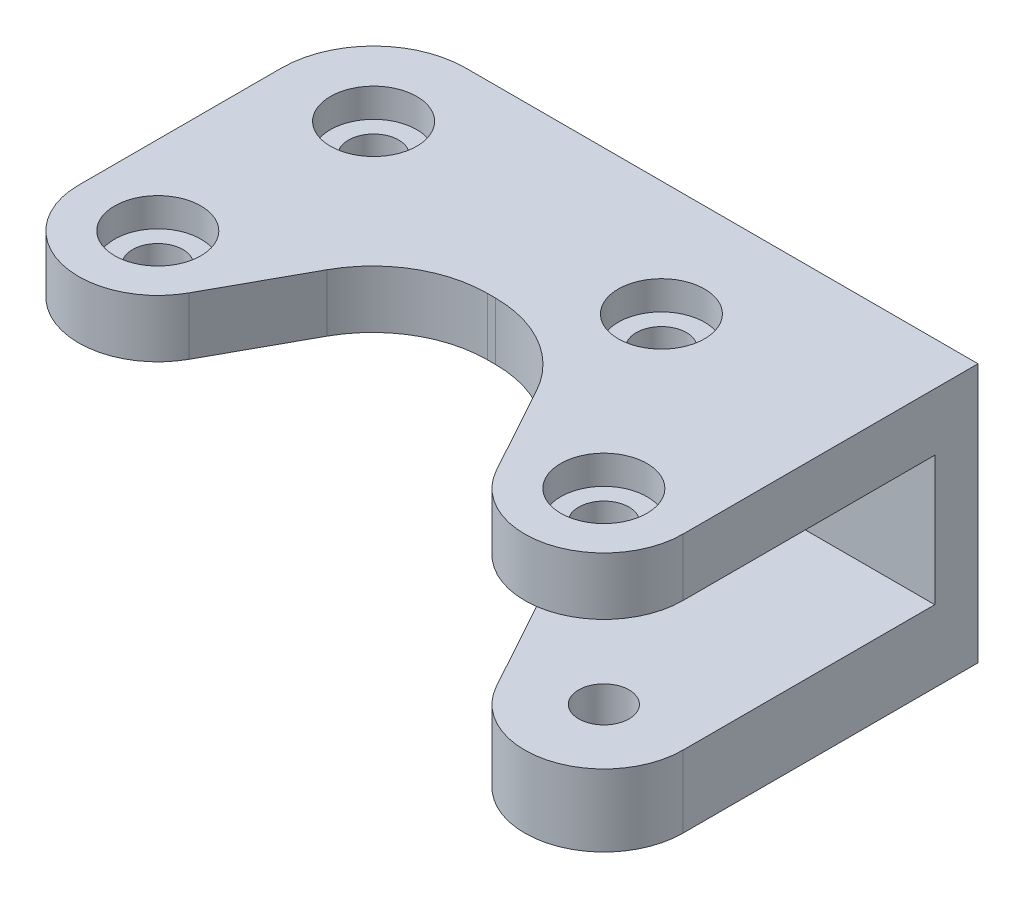
ISO-10303-21;
HEADER;
FILE_DESCRIPTION(('STEP AP214'),'2;1');
FILE_NAME('part.step','',(''),(''),'','','');
FILE_SCHEMA(('AUTOMOTIVE_DESIGN { 1 0 10303 214 1 1 1 1 }'));
ENDSEC;
DATA;
#1=APPLICATION_CONTEXT('core data for automotive mechanical design processes');
#2=APPLICATION_PROTOCOL_DEFINITION('international standard','automotive_design',2000,#1);
#3=PRODUCT_CONTEXT('',#1,'mechanical');
#4=PRODUCT('Part','Part','',(#3));
#5=PRODUCT_RELATED_PRODUCT_CATEGORY('part','',(#4));
#6=PRODUCT_DEFINITION_FORMATION('','',#4);
#7=PRODUCT_DEFINITION_CONTEXT('part definition',#1,'design');
#8=PRODUCT_DEFINITION('design','',#6,#7);
#9=PRODUCT_DEFINITION_SHAPE('','',#8);
#10=(LENGTH_UNIT() NAMED_UNIT(*) SI_UNIT(.MILLI.,.METRE.));
#11=(NAMED_UNIT(*) PLANE_ANGLE_UNIT() SI_UNIT($,.RADIAN.));
#12=(NAMED_UNIT(*) SI_UNIT($,.STERADIAN.) SOLID_ANGLE_UNIT());
#13=UNCERTAINTY_MEASURE_WITH_UNIT(LENGTH_MEASURE(1.E-05),#10,'distance_accuracy_value','');
#14=(GEOMETRIC_REPRESENTATION_CONTEXT(3) GLOBAL_UNCERTAINTY_ASSIGNED_CONTEXT((#13)) GLOBAL_UNIT_ASSIGNED_CONTEXT((#10,
#11,#12)) REPRESENTATION_CONTEXT('',''));
#15=CARTESIAN_POINT('',(0.,0.,0.));
#16=DIRECTION('',(0.,0.,1.));
#17=DIRECTION('',(1.,0.,0.));
#18=AXIS2_PLACEMENT_3D('',#15,#16,#17);
#19=CARTESIAN_POINT('',(14.,9.5,7.));
#20=DIRECTION('',(0.,0.,-1.));
#21=DIRECTION('',(-1.,0.,0.));
#22=AXIS2_PLACEMENT_3D('',#19,#20,#21);
#23=CYLINDRICAL_SURFACE('',#22,1.75);
#24=CARTESIAN_POINT('',(14.,9.5,3.));
#25=DIRECTION('',(0.,0.,-1.));
#26=DIRECTION('',(-1.,0.,0.));
#27=AXIS2_PLACEMENT_3D('',#24,#25,#26);
#28=CIRCLE('',#27,1.75);
#29=CARTESIAN_POINT('',(12.25,9.5,3.));
#30=VERTEX_POINT('',#29);
#31=EDGE_CURVE('E234',#30,#30,#28,.T.);
#32=ORIENTED_EDGE('',*,*,#31,.F.);
#33=EDGE_LOOP('',(#32));
#34=FACE_BOUND('',#33,.T.);
#35=CARTESIAN_POINT('',(14.,9.5,1.));
#36=DIRECTION('',(0.,0.,-1.));
#37=DIRECTION('',(-1.,0.,0.));
#38=AXIS2_PLACEMENT_3D('',#35,#36,#37);
#39=CIRCLE('',#38,1.75);
#40=CARTESIAN_POINT('',(12.25,9.5,1.));
#41=VERTEX_POINT('',#40);
#42=EDGE_CURVE('E250',#41,#41,#39,.F.);
#43=ORIENTED_EDGE('',*,*,#42,.F.);
#44=EDGE_LOOP('',(#43));
#45=FACE_BOUND('',#44,.T.);
#46=ADVANCED_FACE('F33',(#34,#45),#23,.F.);
#47=CARTESIAN_POINT('',(-14.59,8.,6.41));
#48=DIRECTION('',(0.,1.,0.));
#49=DIRECTION('',(0.,0.,1.));
#50=AXIS2_PLACEMENT_3D('',#47,#48,#49);
#51=CYLINDRICAL_SURFACE('',#50,1.75);
#52=CARTESIAN_POINT('',(-14.59,14.,6.41));
#53=DIRECTION('',(0.,1.,0.));
#54=DIRECTION('',(0.,0.,1.));
#55=AXIS2_PLACEMENT_3D('',#52,#53,#54);
#56=CIRCLE('',#55,1.75);
#57=CARTESIAN_POINT('',(-14.59,14.,8.16));
#58=VERTEX_POINT('',#57);
#59=EDGE_CURVE('E238',#58,#58,#56,.T.);
#60=ORIENTED_EDGE('',*,*,#59,.F.);
#61=EDGE_LOOP('',(#60));
#62=FACE_BOUND('',#61,.T.);
#63=CARTESIAN_POINT('',(-14.59,16.,6.41));
#64=DIRECTION('',(0.,1.,0.));
#65=DIRECTION('',(0.,0.,1.));
#66=AXIS2_PLACEMENT_3D('',#63,#64,#65);
#67=CIRCLE('',#66,1.75);
#68=CARTESIAN_POINT('',(-14.59,16.,8.16));
#69=VERTEX_POINT('',#68);
#70=EDGE_CURVE('E241',#69,#69,#67,.F.);
#71=ORIENTED_EDGE('',*,*,#70,.F.);
#72=EDGE_LOOP('',(#71));
#73=FACE_BOUND('',#72,.T.);
#74=ADVANCED_FACE('F397',(#62,#73),#51,.F.);
#75=CARTESIAN_POINT('',(7.,8.,8.));
#76=DIRECTION('',(0.,1.,0.));
#77=DIRECTION('',(0.,0.,1.));
#78=AXIS2_PLACEMENT_3D('',#75,#76,#77);
#79=CYLINDRICAL_SURFACE('',#78,1.75);
#80=CARTESIAN_POINT('',(7.,14.,8.));
#81=DIRECTION('',(0.,1.,0.));
#82=DIRECTION('',(0.,0.,1.));
#83=AXIS2_PLACEMENT_3D('',#80,#81,#82);
#84=CIRCLE('',#83,1.75);
#85=CARTESIAN_POINT('',(7.,14.,9.75));
#86=VERTEX_POINT('',#85);
#87=EDGE_CURVE('E237',#86,#86,#84,.T.);
#88=ORIENTED_EDGE('',*,*,#87,.F.);
#89=EDGE_LOOP('',(#88));
#90=FACE_BOUND('',#89,.T.);
#91=CARTESIAN_POINT('',(7.,16.,8.));
#92=DIRECTION('',(0.,1.,0.));
#93=DIRECTION('',(0.,0.,1.));
#94=AXIS2_PLACEMENT_3D('',#91,#92,#93);
#95=CIRCLE('',#94,1.75);
#96=CARTESIAN_POINT('',(7.,16.,9.75));
#97=VERTEX_POINT('',#96);
#98=EDGE_CURVE('E244',#97,#97,#95,.F.);
#99=ORIENTED_EDGE('',*,*,#98,.F.);
#100=EDGE_LOOP('',(#99));
#101=FACE_BOUND('',#100,.T.);
#102=ADVANCED_FACE('F404',(#90,#101),#79,.F.);
#103=CARTESIAN_POINT('',(-15.5,0.,20.5));
#104=DIRECTION('',(0.,1.,0.));
#105=DIRECTION('',(0.,0.,1.));
#106=AXIS2_PLACEMENT_3D('',#103,#104,#105);
#107=PLANE('',#106);
#108=CARTESIAN_POINT('',(15.5,0.,20.5));
#109=DIRECTION('',(0.,1.,0.));
#110=DIRECTION('',(0.,0.,1.));
#111=AXIS2_PLACEMENT_3D('',#108,#109,#110);
#112=CIRCLE('',#111,1.74999999999999);
#113=CARTESIAN_POINT('',(15.5,0.,22.25));
#114=VERTEX_POINT('',#113);
#115=EDGE_CURVE('E207',#114,#114,#112,.T.);
#116=ORIENTED_EDGE('',*,*,#115,.T.);
#117=EDGE_LOOP('',(#116));
#118=FACE_BOUND('',#117,.T.);
#119=DIRECTION('',(0.,0.,1.));
#120=VECTOR('',#119,1.);
#121=CARTESIAN_POINT('',(0.,0.,0.));
#122=LINE('',#121,#120);
#123=CARTESIAN_POINT('',(0.,0.,0.));
#124=VERTEX_POINT('',#123);
#125=CARTESIAN_POINT('',(0.,0.,3.70870115636353));
#126=VERTEX_POINT('',#125);
#127=EDGE_CURVE('E154',#124,#126,#122,.T.);
#128=ORIENTED_EDGE('',*,*,#127,.F.);
#129=DIRECTION('',(-1.,0.,0.));
#130=VECTOR('',#129,1.);
#131=CARTESIAN_POINT('',(-21.,0.,0.));
#132=LINE('',#131,#130);
#133=CARTESIAN_POINT('',(21.,0.,0.));
#134=VERTEX_POINT('',#133);
#135=EDGE_CURVE('E166',#134,#124,#132,.T.);
#136=ORIENTED_EDGE('',*,*,#135,.F.);
#137=DIRECTION('',(0.,0.,-1.));
#138=VECTOR('',#137,1.);
#139=CARTESIAN_POINT('',(21.,0.,20.5));
#140=LINE('',#139,#138);
#141=CARTESIAN_POINT('',(21.,0.,20.5));
#142=VERTEX_POINT('',#141);
#143=EDGE_CURVE('E175',#142,#134,#140,.T.);
#144=ORIENTED_EDGE('',*,*,#143,.F.);
#145=CARTESIAN_POINT('',(15.5,0.,20.5));
#146=DIRECTION('',(0.,1.,0.));
#147=DIRECTION('',(0.,0.,1.));
#148=AXIS2_PLACEMENT_3D('',#145,#146,#147);
#149=CIRCLE('',#148,5.5);
#150=CARTESIAN_POINT('',(10.6795350402363,0.,23.1482291388191));
#151=VERTEX_POINT('',#150);
#152=EDGE_CURVE('E179',#151,#142,#149,.T.);
#153=ORIENTED_EDGE('',*,*,#152,.F.);
#154=DIRECTION('',(0.481496207058014,0.,0.876448174502489));
#155=VECTOR('',#154,1.);
#156=CARTESIAN_POINT('',(10.6795350402363,0.,23.1482291388191));
#157=LINE('',#156,#155);
#158=EDGE_CURVE('E168',#126,#151,#157,.T.);
#159=ORIENTED_EDGE('',*,*,#158,.F.);
#160=EDGE_LOOP('',(#128,#136,#144,#153,#159));
#161=FACE_BOUND('',#160,.T.);
#162=ADVANCED_FACE('F164',(#118,#161),#107,.F.);
#163=CARTESIAN_POINT('',(10.6795350402363,18.,23.1482291388191));
#164=DIRECTION('',(0.876448174502489,0.,-0.481496207058014));
#165=DIRECTION('',(-0.481496207058014,0.,-0.876448174502489));
#166=AXIS2_PLACEMENT_3D('',#163,#164,#165);
#167=PLANE('',#166);
#168=DIRECTION('',(0.,1.,0.));
#169=VECTOR('',#168,1.);
#170=CARTESIAN_POINT('',(0.,18.,3.70870115636353));
#171=LINE('',#170,#169);
#172=CARTESIAN_POINT('',(0.,5.,3.70870115636353));
#173=VERTEX_POINT('',#172);
#174=EDGE_CURVE('E348',#126,#173,#171,.T.);
#175=ORIENTED_EDGE('',*,*,#174,.F.);
#176=ORIENTED_EDGE('',*,*,#158,.T.);
#177=DIRECTION('',(0.,-1.,0.));
#178=VECTOR('',#177,1.);
#179=CARTESIAN_POINT('',(10.6795350402363,18.,23.1482291388191));
#180=LINE('',#179,#178);
#181=CARTESIAN_POINT('',(10.6795350402363,5.,23.1482291388191));
#182=VERTEX_POINT('',#181);
#183=EDGE_CURVE('E189',#182,#151,#180,.T.);
#184=ORIENTED_EDGE('',*,*,#183,.F.);
#185=DIRECTION('',(-0.481496207058014,0.,-0.876448174502489));
#186=VECTOR('',#185,1.);
#187=CARTESIAN_POINT('',(10.6795350402363,5.,23.1482291388191));
#188=LINE('',#187,#186);
#189=EDGE_CURVE('E273',#182,#173,#188,.T.);
#190=ORIENTED_EDGE('',*,*,#189,.T.);
#191=EDGE_LOOP('',(#175,#176,#184,#190));
#192=FACE_BOUND('',#191,.T.);
#193=ADVANCED_FACE('F347',(#192),#167,.F.);
#194=CARTESIAN_POINT('',(-21.,18.,0.));
#195=DIRECTION('',(0.,0.,1.));
#196=DIRECTION('',(1.,0.,0.));
#197=AXIS2_PLACEMENT_3D('',#194,#195,#196);
#198=PLANE('',#197);
#199=CARTESIAN_POINT('',(14.,9.5,0.));
#200=DIRECTION('',(0.,0.,-1.));
#201=DIRECTION('',(-1.,0.,0.));
#202=AXIS2_PLACEMENT_3D('',#199,#200,#201);
#203=CIRCLE('',#202,3.);
#204=CARTESIAN_POINT('',(11.,9.5,0.));
#205=VERTEX_POINT('',#204);
#206=EDGE_CURVE('E366',#205,#205,#203,.T.);
#207=ORIENTED_EDGE('',*,*,#206,.F.);
#208=EDGE_LOOP('',(#207));
#209=FACE_BOUND('',#208,.T.);
#210=DIRECTION('',(1.,0.,0.));
#211=VECTOR('',#210,1.);
#212=CARTESIAN_POINT('',(-21.,14.,0.));
#213=LINE('',#212,#211);
#214=CARTESIAN_POINT('',(-14.59,14.,0.));
#215=VERTEX_POINT('',#214);
#216=CARTESIAN_POINT('',(0.,14.,0.));
#217=VERTEX_POINT('',#216);
#218=EDGE_CURVE('E349',#215,#217,#213,.T.);
#219=ORIENTED_EDGE('',*,*,#218,.F.);
#220=DIRECTION('',(0.,-1.,0.));
#221=VECTOR('',#220,1.);
#222=CARTESIAN_POINT('',(-14.59,18.,0.));
#223=LINE('',#222,#221);
#224=CARTESIAN_POINT('',(-14.59,18.,0.));
#225=VERTEX_POINT('',#224);
#226=EDGE_CURVE('E41',#215,#225,#223,.F.);
#227=ORIENTED_EDGE('',*,*,#226,.T.);
#228=DIRECTION('',(-1.,0.,0.));
#229=VECTOR('',#228,1.);
#230=CARTESIAN_POINT('',(-21.,18.,0.));
#231=LINE('',#230,#229);
#232=CARTESIAN_POINT('',(21.,18.,0.));
#233=VERTEX_POINT('',#232);
#234=EDGE_CURVE('E185',#233,#225,#231,.T.);
#235=ORIENTED_EDGE('',*,*,#234,.F.);
#236=DIRECTION('',(0.,-1.,0.));
#237=VECTOR('',#236,1.);
#238=CARTESIAN_POINT('',(21.,18.,0.));
#239=LINE('',#238,#237);
#240=EDGE_CURVE('E173',#233,#134,#239,.T.);
#241=ORIENTED_EDGE('',*,*,#240,.T.);
#242=ORIENTED_EDGE('',*,*,#135,.T.);
#243=DIRECTION('',(0.,1.,0.));
#244=VECTOR('',#243,1.);
#245=CARTESIAN_POINT('',(0.,0.,0.));
#246=LINE('',#245,#244);
#247=EDGE_CURVE('E151',#124,#217,#246,.T.);
#248=ORIENTED_EDGE('',*,*,#247,.T.);
#249=EDGE_LOOP('',(#219,#227,#235,#241,#242,#248));
#250=FACE_BOUND('',#249,.T.);
#251=ADVANCED_FACE('F171',(#209,#250),#198,.F.);
#252=CARTESIAN_POINT('',(21.,5.,26.));
#253=DIRECTION('',(0.,-1.,0.));
#254=DIRECTION('',(1.,0.,0.));
#255=AXIS2_PLACEMENT_3D('',#252,#253,#254);
#256=PLANE('',#255);
#257=CARTESIAN_POINT('',(15.5,5.,20.5));
#258=DIRECTION('',(0.,-1.,0.));
#259=DIRECTION('',(1.,0.,0.));
#260=AXIS2_PLACEMENT_3D('',#257,#258,#259);
#261=CIRCLE('',#260,1.74999999999999);
#262=CARTESIAN_POINT('',(17.25,5.,20.5));
#263=VERTEX_POINT('',#262);
#264=EDGE_CURVE('E281',#263,#263,#261,.T.);
#265=ORIENTED_EDGE('',*,*,#264,.T.);
#266=EDGE_LOOP('',(#265));
#267=FACE_BOUND('',#266,.T.);
#268=DIRECTION('',(0.,0.,-1.));
#269=VECTOR('',#268,1.);
#270=CARTESIAN_POINT('',(0.,5.,26.));
#271=LINE('',#270,#269);
#272=CARTESIAN_POINT('',(0.,5.,3.));
#273=VERTEX_POINT('',#272);
#274=EDGE_CURVE('E159',#173,#273,#271,.T.);
#275=ORIENTED_EDGE('',*,*,#274,.F.);
#276=ORIENTED_EDGE('',*,*,#189,.F.);
#277=CARTESIAN_POINT('',(15.5,5.,20.5));
#278=DIRECTION('',(0.,-1.,0.));
#279=DIRECTION('',(1.,0.,0.));
#280=AXIS2_PLACEMENT_3D('',#277,#278,#279);
#281=CIRCLE('',#280,5.5);
#282=CARTESIAN_POINT('',(21.,5.,20.5));
#283=VERTEX_POINT('',#282);
#284=EDGE_CURVE('E270',#283,#182,#281,.T.);
#285=ORIENTED_EDGE('',*,*,#284,.F.);
#286=DIRECTION('',(0.,0.,1.));
#287=VECTOR('',#286,1.);
#288=CARTESIAN_POINT('',(21.,5.,20.5));
#289=LINE('',#288,#287);
#290=CARTESIAN_POINT('',(21.,5.,3.));
#291=VERTEX_POINT('',#290);
#292=EDGE_CURVE('E199',#291,#283,#289,.T.);
#293=ORIENTED_EDGE('',*,*,#292,.F.);
#294=DIRECTION('',(-1.,0.,0.));
#295=VECTOR('',#294,1.);
#296=CARTESIAN_POINT('',(21.,5.,3.));
#297=LINE('',#296,#295);
#298=EDGE_CURVE('E275',#291,#273,#297,.T.);
#299=ORIENTED_EDGE('',*,*,#298,.T.);
#300=EDGE_LOOP('',(#275,#276,#285,#293,#299));
#301=FACE_BOUND('',#300,.T.);
#302=ADVANCED_FACE('F344',(#267,#301),#256,.F.);
#303=CARTESIAN_POINT('',(0.,0.,3.));
#304=DIRECTION('',(0.,0.,-1.));
#305=DIRECTION('',(-1.,0.,0.));
#306=AXIS2_PLACEMENT_3D('',#303,#304,#305);
#307=PLANE('',#306);
#308=ORIENTED_EDGE('',*,*,#31,.T.);
#309=EDGE_LOOP('',(#308));
#310=FACE_BOUND('',#309,.T.);
#311=DIRECTION('',(0.,1.,0.));
#312=VECTOR('',#311,1.);
#313=CARTESIAN_POINT('',(0.,0.,3.));
#314=LINE('',#313,#312);
#315=CARTESIAN_POINT('',(0.,14.,3.));
#316=VERTEX_POINT('',#315);
#317=EDGE_CURVE('E231',#273,#316,#314,.T.);
#318=ORIENTED_EDGE('',*,*,#317,.F.);
#319=ORIENTED_EDGE('',*,*,#298,.F.);
#320=DIRECTION('',(0.,-1.,0.));
#321=VECTOR('',#320,1.);
#322=CARTESIAN_POINT('',(21.,14.,3.));
#323=LINE('',#322,#321);
#324=CARTESIAN_POINT('',(21.,14.,3.));
#325=VERTEX_POINT('',#324);
#326=EDGE_CURVE('E340',#325,#291,#323,.T.);
#327=ORIENTED_EDGE('',*,*,#326,.F.);
#328=DIRECTION('',(1.,0.,0.));
#329=VECTOR('',#328,1.);
#330=CARTESIAN_POINT('',(21.,14.,3.));
#331=LINE('',#330,#329);
#332=EDGE_CURVE('E271',#316,#325,#331,.T.);
#333=ORIENTED_EDGE('',*,*,#332,.F.);
#334=EDGE_LOOP('',(#318,#319,#327,#333));
#335=FACE_BOUND('',#334,.T.);
#336=ADVANCED_FACE('F388',(#310,#335),#307,.F.);
#337=CARTESIAN_POINT('',(15.5,18.,20.5));
#338=DIRECTION('',(0.,-1.,0.));
#339=DIRECTION('',(0.,0.,-1.));
#340=AXIS2_PLACEMENT_3D('',#337,#338,#339);
#341=CYLINDRICAL_SURFACE('',#340,1.74999999999999);
#342=CARTESIAN_POINT('',(15.5,14.,20.5));
#343=DIRECTION('',(0.,1.,0.));
#344=DIRECTION('',(0.,0.,1.));
#345=AXIS2_PLACEMENT_3D('',#342,#343,#344);
#346=CIRCLE('',#345,1.74999999999999);
#347=CARTESIAN_POINT('',(15.5,14.,22.25));
#348=VERTEX_POINT('',#347);
#349=EDGE_CURVE('E298',#348,#348,#346,.T.);
#350=ORIENTED_EDGE('',*,*,#349,.F.);
#351=EDGE_LOOP('',(#350));
#352=FACE_BOUND('',#351,.T.);
#353=CARTESIAN_POINT('',(15.5,16.,20.5));
#354=DIRECTION('',(0.,1.,0.));
#355=DIRECTION('',(0.,0.,1.));
#356=AXIS2_PLACEMENT_3D('',#353,#354,#355);
#357=CIRCLE('',#356,1.74999999999999);
#358=CARTESIAN_POINT('',(15.5,16.,22.25));
#359=VERTEX_POINT('',#358);
#360=EDGE_CURVE('E203',#359,#359,#357,.T.);
#361=ORIENTED_EDGE('',*,*,#360,.T.);
#362=EDGE_LOOP('',(#361));
#363=FACE_BOUND('',#362,.T.);
#364=ADVANCED_FACE('F416',(#352,#363),#341,.F.);
#365=CARTESIAN_POINT('',(-15.5,18.,20.5));
#366=DIRECTION('',(0.,-1.,0.));
#367=DIRECTION('',(0.,0.,-1.));
#368=AXIS2_PLACEMENT_3D('',#365,#366,#367);
#369=CYLINDRICAL_SURFACE('',#368,1.75);
#370=CARTESIAN_POINT('',(-15.5,14.,20.5));
#371=DIRECTION('',(0.,1.,0.));
#372=DIRECTION('',(0.,0.,1.));
#373=AXIS2_PLACEMENT_3D('',#370,#371,#372);
#374=CIRCLE('',#373,1.75);
#375=CARTESIAN_POINT('',(-15.5,14.,22.25));
#376=VERTEX_POINT('',#375);
#377=EDGE_CURVE('E295',#376,#376,#374,.T.);
#378=ORIENTED_EDGE('',*,*,#377,.F.);
#379=EDGE_LOOP('',(#378));
#380=FACE_BOUND('',#379,.T.);
#381=CARTESIAN_POINT('',(-15.5,16.,20.5));
#382=DIRECTION('',(0.,1.,0.));
#383=DIRECTION('',(0.,0.,1.));
#384=AXIS2_PLACEMENT_3D('',#381,#382,#383);
#385=CIRCLE('',#384,1.75);
#386=CARTESIAN_POINT('',(-15.5,16.,22.25));
#387=VERTEX_POINT('',#386);
#388=EDGE_CURVE('E200',#387,#387,#385,.T.);
#389=ORIENTED_EDGE('',*,*,#388,.T.);
#390=EDGE_LOOP('',(#389));
#391=FACE_BOUND('',#390,.T.);
#392=ADVANCED_FACE('F438',(#380,#391),#369,.F.);
#393=CARTESIAN_POINT('',(-5.,18.,12.81));
#394=DIRECTION('',(-0.876448174502489,0.,-0.481496207058014));
#395=DIRECTION('',(-0.481496207058015,0.,0.876448174502489));
#396=AXIS2_PLACEMENT_3D('',#393,#394,#395);
#397=PLANE('',#396);
#398=DIRECTION('',(0.481496207058015,0.,-0.876448174502489));
#399=VECTOR('',#398,1.);
#400=CARTESIAN_POINT('',(-5.,14.,12.81));
#401=LINE('',#400,#399);
#402=CARTESIAN_POINT('',(-10.6795350402363,14.,23.1482291388191));
#403=VERTEX_POINT('',#402);
#404=CARTESIAN_POINT('',(-7.27881229635491,14.,16.9580303435359));
#405=VERTEX_POINT('',#404);
#406=EDGE_CURVE('E291',#403,#405,#401,.T.);
#407=ORIENTED_EDGE('',*,*,#406,.T.);
#408=DIRECTION('',(0.,-1.,0.));
#409=VECTOR('',#408,1.);
#410=CARTESIAN_POINT('',(-7.2788122963549,18.,16.9580303435359));
#411=LINE('',#410,#409);
#412=CARTESIAN_POINT('',(-7.2788122963549,18.,16.9580303435359));
#413=VERTEX_POINT('',#412);
#414=EDGE_CURVE('E218',#405,#413,#411,.F.);
#415=ORIENTED_EDGE('',*,*,#414,.T.);
#416=DIRECTION('',(0.481496207058014,0.,-0.876448174502489));
#417=VECTOR('',#416,1.);
#418=CARTESIAN_POINT('',(-5.,18.,12.81));
#419=LINE('',#418,#417);
#420=CARTESIAN_POINT('',(-10.6795350402363,18.,23.1482291388191));
#421=VERTEX_POINT('',#420);
#422=EDGE_CURVE('E315',#421,#413,#419,.T.);
#423=ORIENTED_EDGE('',*,*,#422,.F.);
#424=DIRECTION('',(0.,-1.,0.));
#425=VECTOR('',#424,1.);
#426=CARTESIAN_POINT('',(-10.6795350402363,18.,23.1482291388191));
#427=LINE('',#426,#425);
#428=EDGE_CURVE('E193',#421,#403,#427,.T.);
#429=ORIENTED_EDGE('',*,*,#428,.T.);
#430=EDGE_LOOP('',(#407,#415,#423,#429));
#431=FACE_BOUND('',#430,.T.);
#432=ADVANCED_FACE('F441',(#431),#397,.F.);
#433=CARTESIAN_POINT('',(-5.,18.,12.81));
#434=DIRECTION('',(0.,0.,-1.));
#435=DIRECTION('',(-1.,0.,0.));
#436=AXIS2_PLACEMENT_3D('',#433,#434,#435);
#437=PLANE('',#436);
#438=DIRECTION('',(1.,0.,0.));
#439=VECTOR('',#438,1.);
#440=CARTESIAN_POINT('',(-5.,18.,12.81));
#441=LINE('',#440,#439);
#442=CARTESIAN_POINT('',(-0.267226900334994,18.,12.81));
#443=VERTEX_POINT('',#442);
#444=CARTESIAN_POINT('',(0.267226900334988,18.,12.81));
#445=VERTEX_POINT('',#444);
#446=EDGE_CURVE('E318',#443,#445,#441,.T.);
#447=ORIENTED_EDGE('',*,*,#446,.F.);
#448=DIRECTION('',(0.,-1.,0.));
#449=VECTOR('',#448,1.);
#450=CARTESIAN_POINT('',(-0.267226900334993,14.,12.81));
#451=LINE('',#450,#449);
#452=CARTESIAN_POINT('',(-0.267226900334994,14.,12.81));
#453=VERTEX_POINT('',#452);
#454=EDGE_CURVE('E215',#443,#453,#451,.T.);
#455=ORIENTED_EDGE('',*,*,#454,.T.);
#456=DIRECTION('',(1.,0.,0.));
#457=VECTOR('',#456,1.);
#458=CARTESIAN_POINT('',(-5.,14.,12.81));
#459=LINE('',#458,#457);
#460=CARTESIAN_POINT('',(0.267226900334988,14.,12.81));
#461=VERTEX_POINT('',#460);
#462=EDGE_CURVE('E288',#453,#461,#459,.T.);
#463=ORIENTED_EDGE('',*,*,#462,.T.);
#464=DIRECTION('',(0.,-1.,0.));
#465=VECTOR('',#464,1.);
#466=CARTESIAN_POINT('',(0.267226900334988,18.,12.81));
#467=LINE('',#466,#465);
#468=EDGE_CURVE('E213',#461,#445,#467,.F.);
#469=ORIENTED_EDGE('',*,*,#468,.T.);
#470=EDGE_LOOP('',(#447,#455,#463,#469));
#471=FACE_BOUND('',#470,.T.);
#472=ADVANCED_FACE('F532',(#471),#437,.F.);
#473=DIRECTION('',(0.481496207058014,0.,0.876448174502489));
#474=VECTOR('',#473,1.);
#475=CARTESIAN_POINT('',(10.6795350402363,18.,23.1482291388191));
#476=LINE('',#475,#474);
#477=CARTESIAN_POINT('',(7.27881229635491,18.,16.9580303435359));
#478=VERTEX_POINT('',#477);
#479=CARTESIAN_POINT('',(10.6795350402363,18.,23.1482291388191));
#480=VERTEX_POINT('',#479);
#481=EDGE_CURVE('E321',#478,#480,#476,.T.);
#482=ORIENTED_EDGE('',*,*,#481,.F.);
#483=DIRECTION('',(0.,-1.,0.));
#484=VECTOR('',#483,1.);
#485=CARTESIAN_POINT('',(7.27881229635491,14.,16.9580303435359));
#486=LINE('',#485,#484);
#487=CARTESIAN_POINT('',(7.27881229635491,14.,16.9580303435359));
#488=VERTEX_POINT('',#487);
#489=EDGE_CURVE('E220',#478,#488,#486,.T.);
#490=ORIENTED_EDGE('',*,*,#489,.T.);
#491=DIRECTION('',(0.481496207058014,0.,0.876448174502489));
#492=VECTOR('',#491,1.);
#493=CARTESIAN_POINT('',(10.6795350402363,14.,23.1482291388191));
#494=LINE('',#493,#492);
#495=CARTESIAN_POINT('',(10.6795350402363,14.,23.1482291388191));
#496=VERTEX_POINT('',#495);
#497=EDGE_CURVE('E286',#488,#496,#494,.T.);
#498=ORIENTED_EDGE('',*,*,#497,.T.);
#499=EDGE_CURVE('E190',#480,#496,#180,.T.);
#500=ORIENTED_EDGE('',*,*,#499,.F.);
#501=EDGE_LOOP('',(#482,#490,#498,#500));
#502=FACE_BOUND('',#501,.T.);
#503=ADVANCED_FACE('F393',(#502),#167,.F.);
#504=CARTESIAN_POINT('',(15.5,18.,20.5));
#505=DIRECTION('',(0.,-1.,0.));
#506=DIRECTION('',(0.,0.,-1.));
#507=AXIS2_PLACEMENT_3D('',#504,#505,#506);
#508=CYLINDRICAL_SURFACE('',#507,5.5);
#509=CARTESIAN_POINT('',(15.5,14.,20.5));
#510=DIRECTION('',(0.,1.,0.));
#511=DIRECTION('',(0.,0.,1.));
#512=AXIS2_PLACEMENT_3D('',#509,#510,#511);
#513=CIRCLE('',#512,5.5);
#514=CARTESIAN_POINT('',(21.,14.,20.5));
#515=VERTEX_POINT('',#514);
#516=EDGE_CURVE('E284',#496,#515,#513,.T.);
#517=ORIENTED_EDGE('',*,*,#516,.T.);
#518=DIRECTION('',(0.,-1.,0.));
#519=VECTOR('',#518,1.);
#520=CARTESIAN_POINT('',(21.,18.,20.5));
#521=LINE('',#520,#519);
#522=CARTESIAN_POINT('',(21.,18.,20.5));
#523=VERTEX_POINT('',#522);
#524=EDGE_CURVE('E186',#523,#515,#521,.T.);
#525=ORIENTED_EDGE('',*,*,#524,.F.);
#526=CARTESIAN_POINT('',(15.5,18.,20.5));
#527=DIRECTION('',(0.,1.,0.));
#528=DIRECTION('',(0.,0.,1.));
#529=AXIS2_PLACEMENT_3D('',#526,#527,#528);
#530=CIRCLE('',#529,5.5);
#531=EDGE_CURVE('E323',#480,#523,#530,.T.);
#532=ORIENTED_EDGE('',*,*,#531,.F.);
#533=ORIENTED_EDGE('',*,*,#499,.T.);
#534=EDGE_LOOP('',(#517,#525,#532,#533));
#535=FACE_BOUND('',#534,.T.);
#536=ADVANCED_FACE('F447',(#535),#508,.T.);
#537=ORIENTED_EDGE('',*,*,#264,.F.);
#538=EDGE_LOOP('',(#537));
#539=FACE_BOUND('',#538,.T.);
#540=ORIENTED_EDGE('',*,*,#115,.F.);
#541=EDGE_LOOP('',(#540));
#542=FACE_BOUND('',#541,.T.);
#543=ADVANCED_FACE('F443',(#539,#542),#341,.F.);
#544=CARTESIAN_POINT('',(-15.5,18.,20.5));
#545=DIRECTION('',(0.,1.,0.));
#546=DIRECTION('',(0.,0.,1.));
#547=AXIS2_PLACEMENT_3D('',#544,#545,#546);
#548=PLANE('',#547);
#549=CARTESIAN_POINT('',(7.,18.,8.));
#550=DIRECTION('',(0.,1.,0.));
#551=DIRECTION('',(0.,0.,1.));
#552=AXIS2_PLACEMENT_3D('',#549,#550,#551);
#553=CIRCLE('',#552,3.);
#554=CARTESIAN_POINT('',(7.,18.,11.));
#555=VERTEX_POINT('',#554);
#556=EDGE_CURVE('E361',#555,#555,#553,.T.);
#557=ORIENTED_EDGE('',*,*,#556,.F.);
#558=EDGE_LOOP('',(#557));
#559=FACE_BOUND('',#558,.T.);
#560=CARTESIAN_POINT('',(-14.59,18.,6.41));
#561=DIRECTION('',(0.,1.,0.));
#562=DIRECTION('',(0.,0.,1.));
#563=AXIS2_PLACEMENT_3D('',#560,#561,#562);
#564=CIRCLE('',#563,3.);
#565=CARTESIAN_POINT('',(-14.59,18.,9.41));
#566=VERTEX_POINT('',#565);
#567=EDGE_CURVE('E253',#566,#566,#564,.T.);
#568=ORIENTED_EDGE('',*,*,#567,.F.);
#569=EDGE_LOOP('',(#568));
#570=FACE_BOUND('',#569,.T.);
#571=CARTESIAN_POINT('',(-15.5,18.,20.5));
#572=DIRECTION('',(0.,1.,0.));
#573=DIRECTION('',(0.,0.,1.));
#574=AXIS2_PLACEMENT_3D('',#571,#572,#573);
#575=CIRCLE('',#574,3.);
#576=CARTESIAN_POINT('',(-15.5,18.,23.5));
#577=VERTEX_POINT('',#576);
#578=EDGE_CURVE('E304',#577,#577,#575,.T.);
#579=ORIENTED_EDGE('',*,*,#578,.F.);
#580=EDGE_LOOP('',(#579));
#581=FACE_BOUND('',#580,.T.);
#582=CARTESIAN_POINT('',(15.5,18.,20.5));
#583=DIRECTION('',(0.,1.,0.));
#584=DIRECTION('',(0.,0.,1.));
#585=AXIS2_PLACEMENT_3D('',#582,#583,#584);
#586=CIRCLE('',#585,3.);
#587=CARTESIAN_POINT('',(15.5,18.,23.5));
#588=VERTEX_POINT('',#587);
#589=EDGE_CURVE('E301',#588,#588,#586,.T.);
#590=ORIENTED_EDGE('',*,*,#589,.F.);
#591=EDGE_LOOP('',(#590));
#592=FACE_BOUND('',#591,.T.);
#593=ORIENTED_EDGE('',*,*,#234,.T.);
#594=CARTESIAN_POINT('',(-14.59,18.,6.41));
#595=DIRECTION('',(0.,1.,0.));
#596=DIRECTION('',(0.,0.,1.));
#597=AXIS2_PLACEMENT_3D('',#594,#595,#596);
#598=CIRCLE('',#597,6.41);
#599=CARTESIAN_POINT('',(-21.,18.,6.41));
#600=VERTEX_POINT('',#599);
#601=EDGE_CURVE('E11',#225,#600,#598,.T.);
#602=ORIENTED_EDGE('',*,*,#601,.T.);
#603=DIRECTION('',(0.,0.,1.));
#604=VECTOR('',#603,1.);
#605=CARTESIAN_POINT('',(-21.,18.,0.));
#606=LINE('',#605,#604);
#607=CARTESIAN_POINT('',(-21.,18.,20.5));
#608=VERTEX_POINT('',#607);
#609=EDGE_CURVE('E174',#600,#608,#606,.T.);
#610=ORIENTED_EDGE('',*,*,#609,.T.);
#611=CARTESIAN_POINT('',(-15.5,18.,20.5));
#612=DIRECTION('',(0.,1.,0.));
#613=DIRECTION('',(0.,0.,1.));
#614=AXIS2_PLACEMENT_3D('',#611,#612,#613);
#615=CIRCLE('',#614,5.5);
#616=EDGE_CURVE('E177',#608,#421,#615,.T.);
#617=ORIENTED_EDGE('',*,*,#616,.T.);
#618=ORIENTED_EDGE('',*,*,#422,.T.);
#619=CARTESIAN_POINT('',(-0.267226900334992,18.,20.81));
#620=DIRECTION('',(0.,1.,0.));
#621=DIRECTION('',(0.,0.,1.));
#622=AXIS2_PLACEMENT_3D('',#619,#620,#621);
#623=CIRCLE('',#622,8.);
#624=EDGE_CURVE('E225',#413,#443,#623,.F.);
#625=ORIENTED_EDGE('',*,*,#624,.T.);
#626=ORIENTED_EDGE('',*,*,#446,.T.);
#627=CARTESIAN_POINT('',(0.267226900334989,18.,20.81));
#628=DIRECTION('',(0.,1.,0.));
#629=DIRECTION('',(0.,0.,1.));
#630=AXIS2_PLACEMENT_3D('',#627,#628,#629);
#631=CIRCLE('',#630,8.);
#632=EDGE_CURVE('E229',#445,#478,#631,.F.);
#633=ORIENTED_EDGE('',*,*,#632,.T.);
#634=ORIENTED_EDGE('',*,*,#481,.T.);
#635=ORIENTED_EDGE('',*,*,#531,.T.);
#636=DIRECTION('',(0.,0.,-1.));
#637=VECTOR('',#636,1.);
#638=CARTESIAN_POINT('',(21.,18.,20.5));
#639=LINE('',#638,#637);
#640=EDGE_CURVE('E325',#523,#233,#639,.T.);
#641=ORIENTED_EDGE('',*,*,#640,.T.);
#642=EDGE_LOOP('',(#593,#602,#610,#617,#618,#625,#626,#633,#634,#635,#641));
#643=FACE_BOUND('',#642,.T.);
#644=ADVANCED_FACE('F446',(#559,#570,#581,#592,#643),#548,.T.);
#645=CARTESIAN_POINT('',(-21.,18.,0.));
#646=DIRECTION('',(1.,0.,0.));
#647=DIRECTION('',(0.,0.,-1.));
#648=AXIS2_PLACEMENT_3D('',#645,#646,#647);
#649=PLANE('',#648);
#650=ORIENTED_EDGE('',*,*,#609,.F.);
#651=DIRECTION('',(0.,-1.,0.));
#652=VECTOR('',#651,1.);
#653=CARTESIAN_POINT('',(-21.,18.,6.41));
#654=LINE('',#653,#652);
#655=CARTESIAN_POINT('',(-21.,14.,6.41));
#656=VERTEX_POINT('',#655);
#657=EDGE_CURVE('E233',#600,#656,#654,.T.);
#658=ORIENTED_EDGE('',*,*,#657,.T.);
#659=DIRECTION('',(0.,0.,-1.));
#660=VECTOR('',#659,1.);
#661=CARTESIAN_POINT('',(-21.,14.,26.));
#662=LINE('',#661,#660);
#663=CARTESIAN_POINT('',(-21.,14.,20.5));
#664=VERTEX_POINT('',#663);
#665=EDGE_CURVE('E263',#664,#656,#662,.T.);
#666=ORIENTED_EDGE('',*,*,#665,.F.);
#667=DIRECTION('',(0.,-1.,0.));
#668=VECTOR('',#667,1.);
#669=CARTESIAN_POINT('',(-21.,18.,20.5));
#670=LINE('',#669,#668);
#671=EDGE_CURVE('E196',#608,#664,#670,.T.);
#672=ORIENTED_EDGE('',*,*,#671,.F.);
#673=EDGE_LOOP('',(#650,#658,#666,#672));
#674=FACE_BOUND('',#673,.T.);
#675=ADVANCED_FACE('F261',(#674),#649,.F.);
#676=CARTESIAN_POINT('',(-15.5,18.,20.5));
#677=DIRECTION('',(0.,-1.,0.));
#678=DIRECTION('',(0.,0.,-1.));
#679=AXIS2_PLACEMENT_3D('',#676,#677,#678);
#680=CYLINDRICAL_SURFACE('',#679,5.5);
#681=CARTESIAN_POINT('',(-15.5,14.,20.5));
#682=DIRECTION('',(0.,1.,0.));
#683=DIRECTION('',(0.,0.,1.));
#684=AXIS2_PLACEMENT_3D('',#681,#682,#683);
#685=CIRCLE('',#684,5.5);
#686=EDGE_CURVE('E269',#664,#403,#685,.T.);
#687=ORIENTED_EDGE('',*,*,#686,.T.);
#688=ORIENTED_EDGE('',*,*,#428,.F.);
#689=ORIENTED_EDGE('',*,*,#616,.F.);
#690=ORIENTED_EDGE('',*,*,#671,.T.);
#691=EDGE_LOOP('',(#687,#688,#689,#690));
#692=FACE_BOUND('',#691,.T.);
#693=ADVANCED_FACE('F504',(#692),#680,.T.);
#694=EDGE_CURVE('E184',#283,#142,#521,.T.);
#695=ORIENTED_EDGE('',*,*,#694,.F.);
#696=ORIENTED_EDGE('',*,*,#284,.T.);
#697=ORIENTED_EDGE('',*,*,#183,.T.);
#698=ORIENTED_EDGE('',*,*,#152,.T.);
#699=EDGE_LOOP('',(#695,#696,#697,#698));
#700=FACE_BOUND('',#699,.T.);
#701=ADVANCED_FACE('F332',(#700),#508,.T.);
#702=CARTESIAN_POINT('',(21.,18.,20.5));
#703=DIRECTION('',(-1.,0.,0.));
#704=DIRECTION('',(0.,0.,1.));
#705=AXIS2_PLACEMENT_3D('',#702,#703,#704);
#706=PLANE('',#705);
#707=ORIENTED_EDGE('',*,*,#524,.T.);
#708=DIRECTION('',(0.,0.,-1.));
#709=VECTOR('',#708,1.);
#710=CARTESIAN_POINT('',(21.,14.,20.5));
#711=LINE('',#710,#709);
#712=EDGE_CURVE('E210',#515,#325,#711,.T.);
#713=ORIENTED_EDGE('',*,*,#712,.T.);
#714=ORIENTED_EDGE('',*,*,#326,.T.);
#715=ORIENTED_EDGE('',*,*,#292,.T.);
#716=ORIENTED_EDGE('',*,*,#694,.T.);
#717=ORIENTED_EDGE('',*,*,#143,.T.);
#718=ORIENTED_EDGE('',*,*,#240,.F.);
#719=ORIENTED_EDGE('',*,*,#640,.F.);
#720=EDGE_LOOP('',(#707,#713,#714,#715,#716,#717,#718,#719));
#721=FACE_BOUND('',#720,.T.);
#722=ADVANCED_FACE('F335',(#721),#706,.F.);
#723=CARTESIAN_POINT('',(-15.5,16.,20.5));
#724=DIRECTION('',(0.,1.,0.));
#725=DIRECTION('',(0.,0.,1.));
#726=AXIS2_PLACEMENT_3D('',#723,#724,#725);
#727=CYLINDRICAL_SURFACE('',#726,3.);
#728=CARTESIAN_POINT('',(-15.5,16.,20.5));
#729=DIRECTION('',(0.,1.,0.));
#730=DIRECTION('',(0.,0.,1.));
#731=AXIS2_PLACEMENT_3D('',#728,#729,#730);
#732=CIRCLE('',#731,3.);
#733=CARTESIAN_POINT('',(-15.5,16.,23.5));
#734=VERTEX_POINT('',#733);
#735=EDGE_CURVE('E204',#734,#734,#732,.T.);
#736=ORIENTED_EDGE('',*,*,#735,.F.);
#737=EDGE_LOOP('',(#736));
#738=FACE_BOUND('',#737,.T.);
#739=ORIENTED_EDGE('',*,*,#578,.T.);
#740=EDGE_LOOP('',(#739));
#741=FACE_BOUND('',#740,.T.);
#742=ADVANCED_FACE('F427',(#738,#741),#727,.F.);
#743=CARTESIAN_POINT('',(-15.5,16.,20.5));
#744=DIRECTION('',(0.,1.,0.));
#745=DIRECTION('',(0.,0.,1.));
#746=AXIS2_PLACEMENT_3D('',#743,#744,#745);
#747=PLANE('',#746);
#748=ORIENTED_EDGE('',*,*,#388,.F.);
#749=EDGE_LOOP('',(#748));
#750=FACE_BOUND('',#749,.T.);
#751=ORIENTED_EDGE('',*,*,#735,.T.);
#752=EDGE_LOOP('',(#751));
#753=FACE_BOUND('',#752,.T.);
#754=ADVANCED_FACE('F423',(#750,#753),#747,.T.);
#755=CARTESIAN_POINT('',(15.5,16.,20.5));
#756=DIRECTION('',(0.,1.,0.));
#757=DIRECTION('',(0.,0.,1.));
#758=AXIS2_PLACEMENT_3D('',#755,#756,#757);
#759=CYLINDRICAL_SURFACE('',#758,3.);
#760=CARTESIAN_POINT('',(15.5,16.,20.5));
#761=DIRECTION('',(0.,1.,0.));
#762=DIRECTION('',(0.,0.,1.));
#763=AXIS2_PLACEMENT_3D('',#760,#761,#762);
#764=CIRCLE('',#763,3.);
#765=CARTESIAN_POINT('',(15.5,16.,23.5));
#766=VERTEX_POINT('',#765);
#767=EDGE_CURVE('E307',#766,#766,#764,.T.);
#768=ORIENTED_EDGE('',*,*,#767,.F.);
#769=EDGE_LOOP('',(#768));
#770=FACE_BOUND('',#769,.T.);
#771=ORIENTED_EDGE('',*,*,#589,.T.);
#772=EDGE_LOOP('',(#771));
#773=FACE_BOUND('',#772,.T.);
#774=ADVANCED_FACE('F426',(#770,#773),#759,.F.);
#775=CARTESIAN_POINT('',(15.5,16.,20.5));
#776=DIRECTION('',(0.,1.,0.));
#777=DIRECTION('',(0.,0.,1.));
#778=AXIS2_PLACEMENT_3D('',#775,#776,#777);
#779=PLANE('',#778);
#780=ORIENTED_EDGE('',*,*,#360,.F.);
#781=EDGE_LOOP('',(#780));
#782=FACE_BOUND('',#781,.T.);
#783=ORIENTED_EDGE('',*,*,#767,.T.);
#784=EDGE_LOOP('',(#783));
#785=FACE_BOUND('',#784,.T.);
#786=ADVANCED_FACE('F420',(#782,#785),#779,.T.);
#787=CARTESIAN_POINT('',(21.,14.,26.));
#788=DIRECTION('',(0.,1.,0.));
#789=DIRECTION('',(0.,0.,1.));
#790=AXIS2_PLACEMENT_3D('',#787,#788,#789);
#791=PLANE('',#790);
#792=ORIENTED_EDGE('',*,*,#87,.T.);
#793=EDGE_LOOP('',(#792));
#794=FACE_BOUND('',#793,.T.);
#795=ORIENTED_EDGE('',*,*,#59,.T.);
#796=EDGE_LOOP('',(#795));
#797=FACE_BOUND('',#796,.T.);
#798=ORIENTED_EDGE('',*,*,#665,.T.);
#799=CARTESIAN_POINT('',(-14.59,14.,6.41));
#800=DIRECTION('',(0.,1.,0.));
#801=DIRECTION('',(0.,0.,1.));
#802=AXIS2_PLACEMENT_3D('',#799,#800,#801);
#803=CIRCLE('',#802,6.41);
#804=EDGE_CURVE('E55',#656,#215,#803,.F.);
#805=ORIENTED_EDGE('',*,*,#804,.T.);
#806=ORIENTED_EDGE('',*,*,#218,.T.);
#807=DIRECTION('',(0.,0.,1.));
#808=VECTOR('',#807,1.);
#809=CARTESIAN_POINT('',(0.,14.,0.));
#810=LINE('',#809,#808);
#811=EDGE_CURVE('E157',#217,#316,#810,.T.);
#812=ORIENTED_EDGE('',*,*,#811,.T.);
#813=ORIENTED_EDGE('',*,*,#332,.T.);
#814=ORIENTED_EDGE('',*,*,#712,.F.);
#815=ORIENTED_EDGE('',*,*,#516,.F.);
#816=ORIENTED_EDGE('',*,*,#497,.F.);
#817=CARTESIAN_POINT('',(0.267226900334989,14.,20.81));
#818=DIRECTION('',(0.,1.,0.));
#819=DIRECTION('',(0.,0.,1.));
#820=AXIS2_PLACEMENT_3D('',#817,#818,#819);
#821=CIRCLE('',#820,8.);
#822=EDGE_CURVE('E227',#488,#461,#821,.T.);
#823=ORIENTED_EDGE('',*,*,#822,.T.);
#824=ORIENTED_EDGE('',*,*,#462,.F.);
#825=CARTESIAN_POINT('',(-0.267226900334992,14.,20.81));
#826=DIRECTION('',(0.,1.,0.));
#827=DIRECTION('',(0.,0.,1.));
#828=AXIS2_PLACEMENT_3D('',#825,#826,#827);
#829=CIRCLE('',#828,8.);
#830=EDGE_CURVE('E223',#453,#405,#829,.T.);
#831=ORIENTED_EDGE('',*,*,#830,.T.);
#832=ORIENTED_EDGE('',*,*,#406,.F.);
#833=ORIENTED_EDGE('',*,*,#686,.F.);
#834=EDGE_LOOP('',(#798,#805,#806,#812,#813,#814,#815,#816,#823,#824,#831,#832,#833));
#835=FACE_BOUND('',#834,.T.);
#836=ORIENTED_EDGE('',*,*,#377,.T.);
#837=EDGE_LOOP('',(#836));
#838=FACE_BOUND('',#837,.T.);
#839=ORIENTED_EDGE('',*,*,#349,.T.);
#840=EDGE_LOOP('',(#839));
#841=FACE_BOUND('',#840,.T.);
#842=ADVANCED_FACE('F266',(#794,#797,#835,#838,#841),#791,.F.);
#843=CARTESIAN_POINT('',(-0.267226900334992,18.,20.81));
#844=DIRECTION('',(0.,1.,0.));
#845=DIRECTION('',(0.,0.,1.));
#846=AXIS2_PLACEMENT_3D('',#843,#844,#845);
#847=CYLINDRICAL_SURFACE('',#846,8.);
#848=ORIENTED_EDGE('',*,*,#624,.F.);
#849=ORIENTED_EDGE('',*,*,#414,.F.);
#850=ORIENTED_EDGE('',*,*,#830,.F.);
#851=ORIENTED_EDGE('',*,*,#454,.F.);
#852=EDGE_LOOP('',(#848,#849,#850,#851));
#853=FACE_BOUND('',#852,.T.);
#854=ADVANCED_FACE('F419',(#853),#847,.F.);
#855=CARTESIAN_POINT('',(0.267226900334989,18.,20.81));
#856=DIRECTION('',(0.,1.,0.));
#857=DIRECTION('',(0.,0.,1.));
#858=AXIS2_PLACEMENT_3D('',#855,#856,#857);
#859=CYLINDRICAL_SURFACE('',#858,8.);
#860=ORIENTED_EDGE('',*,*,#632,.F.);
#861=ORIENTED_EDGE('',*,*,#468,.F.);
#862=ORIENTED_EDGE('',*,*,#822,.F.);
#863=ORIENTED_EDGE('',*,*,#489,.F.);
#864=EDGE_LOOP('',(#860,#861,#862,#863));
#865=FACE_BOUND('',#864,.T.);
#866=ADVANCED_FACE('F413',(#865),#859,.F.);
#867=CARTESIAN_POINT('',(0.,0.,0.));
#868=DIRECTION('',(-1.,0.,0.));
#869=DIRECTION('',(0.,0.,1.));
#870=AXIS2_PLACEMENT_3D('',#867,#868,#869);
#871=PLANE('',#870);
#872=ORIENTED_EDGE('',*,*,#174,.T.);
#873=ORIENTED_EDGE('',*,*,#274,.T.);
#874=ORIENTED_EDGE('',*,*,#317,.T.);
#875=ORIENTED_EDGE('',*,*,#811,.F.);
#876=ORIENTED_EDGE('',*,*,#247,.F.);
#877=ORIENTED_EDGE('',*,*,#127,.T.);
#878=EDGE_LOOP('',(#872,#873,#874,#875,#876,#877));
#879=FACE_BOUND('',#878,.T.);
#880=ADVANCED_FACE('F153',(#879),#871,.T.);
#881=CARTESIAN_POINT('',(7.,16.,8.));
#882=DIRECTION('',(0.,1.,0.));
#883=DIRECTION('',(0.,0.,1.));
#884=AXIS2_PLACEMENT_3D('',#881,#882,#883);
#885=PLANE('',#884);
#886=CARTESIAN_POINT('',(7.,16.,8.));
#887=DIRECTION('',(0.,1.,0.));
#888=DIRECTION('',(0.,0.,1.));
#889=AXIS2_PLACEMENT_3D('',#886,#887,#888);
#890=CIRCLE('',#889,3.);
#891=CARTESIAN_POINT('',(7.,16.,11.));
#892=VERTEX_POINT('',#891);
#893=EDGE_CURVE('E247',#892,#892,#890,.T.);
#894=ORIENTED_EDGE('',*,*,#893,.T.);
#895=EDGE_LOOP('',(#894));
#896=FACE_BOUND('',#895,.T.);
#897=ORIENTED_EDGE('',*,*,#98,.T.);
#898=EDGE_LOOP('',(#897));
#899=FACE_BOUND('',#898,.T.);
#900=ADVANCED_FACE('F412',(#896,#899),#885,.T.);
#901=CARTESIAN_POINT('',(7.,16.,8.));
#902=DIRECTION('',(0.,1.,0.));
#903=DIRECTION('',(0.,0.,1.));
#904=AXIS2_PLACEMENT_3D('',#901,#902,#903);
#905=CYLINDRICAL_SURFACE('',#904,3.);
#906=ORIENTED_EDGE('',*,*,#893,.F.);
#907=EDGE_LOOP('',(#906));
#908=FACE_BOUND('',#907,.T.);
#909=ORIENTED_EDGE('',*,*,#556,.T.);
#910=EDGE_LOOP('',(#909));
#911=FACE_BOUND('',#910,.T.);
#912=ADVANCED_FACE('F472',(#908,#911),#905,.F.);
#913=CARTESIAN_POINT('',(-14.59,16.,6.41));
#914=DIRECTION('',(0.,1.,0.));
#915=DIRECTION('',(0.,0.,1.));
#916=AXIS2_PLACEMENT_3D('',#913,#914,#915);
#917=PLANE('',#916);
#918=CARTESIAN_POINT('',(-14.59,16.,6.41));
#919=DIRECTION('',(0.,1.,0.));
#920=DIRECTION('',(0.,0.,1.));
#921=AXIS2_PLACEMENT_3D('',#918,#919,#920);
#922=CIRCLE('',#921,3.);
#923=CARTESIAN_POINT('',(-14.59,16.,9.41));
#924=VERTEX_POINT('',#923);
#925=EDGE_CURVE('E358',#924,#924,#922,.T.);
#926=ORIENTED_EDGE('',*,*,#925,.T.);
#927=EDGE_LOOP('',(#926));
#928=FACE_BOUND('',#927,.T.);
#929=ORIENTED_EDGE('',*,*,#70,.T.);
#930=EDGE_LOOP('',(#929));
#931=FACE_BOUND('',#930,.T.);
#932=ADVANCED_FACE('F468',(#928,#931),#917,.T.);
#933=CARTESIAN_POINT('',(-14.59,16.,6.41));
#934=DIRECTION('',(0.,1.,0.));
#935=DIRECTION('',(0.,0.,1.));
#936=AXIS2_PLACEMENT_3D('',#933,#934,#935);
#937=CYLINDRICAL_SURFACE('',#936,3.);
#938=ORIENTED_EDGE('',*,*,#925,.F.);
#939=EDGE_LOOP('',(#938));
#940=FACE_BOUND('',#939,.T.);
#941=ORIENTED_EDGE('',*,*,#567,.T.);
#942=EDGE_LOOP('',(#941));
#943=FACE_BOUND('',#942,.T.);
#944=ADVANCED_FACE('F465',(#940,#943),#937,.F.);
#945=CARTESIAN_POINT('',(14.,9.5,1.));
#946=DIRECTION('',(0.,0.,-1.));
#947=DIRECTION('',(-1.,0.,0.));
#948=AXIS2_PLACEMENT_3D('',#945,#946,#947);
#949=PLANE('',#948);
#950=CARTESIAN_POINT('',(14.,9.5,1.));
#951=DIRECTION('',(0.,0.,-1.));
#952=DIRECTION('',(-1.,0.,0.));
#953=AXIS2_PLACEMENT_3D('',#950,#951,#952);
#954=CIRCLE('',#953,3.);
#955=CARTESIAN_POINT('',(11.,9.5,1.));
#956=VERTEX_POINT('',#955);
#957=EDGE_CURVE('E254',#956,#956,#954,.T.);
#958=ORIENTED_EDGE('',*,*,#957,.T.);
#959=EDGE_LOOP('',(#958));
#960=FACE_BOUND('',#959,.T.);
#961=ORIENTED_EDGE('',*,*,#42,.T.);
#962=EDGE_LOOP('',(#961));
#963=FACE_BOUND('',#962,.T.);
#964=ADVANCED_FACE('F372',(#960,#963),#949,.T.);
#965=CARTESIAN_POINT('',(14.,9.5,1.));
#966=DIRECTION('',(0.,0.,-1.));
#967=DIRECTION('',(-1.,0.,0.));
#968=AXIS2_PLACEMENT_3D('',#965,#966,#967);
#969=CYLINDRICAL_SURFACE('',#968,3.);
#970=ORIENTED_EDGE('',*,*,#957,.F.);
#971=EDGE_LOOP('',(#970));
#972=FACE_BOUND('',#971,.T.);
#973=ORIENTED_EDGE('',*,*,#206,.T.);
#974=EDGE_LOOP('',(#973));
#975=FACE_BOUND('',#974,.T.);
#976=ADVANCED_FACE('F375',(#972,#975),#969,.F.);
#977=CARTESIAN_POINT('',(-14.59,18.,6.41));
#978=DIRECTION('',(0.,-1.,0.));
#979=DIRECTION('',(0.,0.,-1.));
#980=AXIS2_PLACEMENT_3D('',#977,#978,#979);
#981=CYLINDRICAL_SURFACE('',#980,6.41);
#982=ORIENTED_EDGE('',*,*,#601,.F.);
#983=ORIENTED_EDGE('',*,*,#226,.F.);
#984=ORIENTED_EDGE('',*,*,#804,.F.);
#985=ORIENTED_EDGE('',*,*,#657,.F.);
#986=EDGE_LOOP('',(#982,#983,#984,#985));
#987=FACE_BOUND('',#986,.T.);
#988=ADVANCED_FACE('F35',(#987),#981,.T.);
#989=CLOSED_SHELL('',(#46,#74,#102,#162,#193,#251,#302,#336,#364,#392,#432,#472,#503,#536,#543,
#644,#675,#693,#701,#722,#742,#754,#774,#786,#842,#854,#866,#880,#900,#912,#932,#944,#964,#976,#988));
#990=MANIFOLD_SOLID_BREP('B2',#989);
#991=ADVANCED_BREP_SHAPE_REPRESENTATION('',(#18,#990),#14);
#992=SHAPE_DEFINITION_REPRESENTATION(#9,#991);
ENDSEC;
END-ISO-10303-21;
